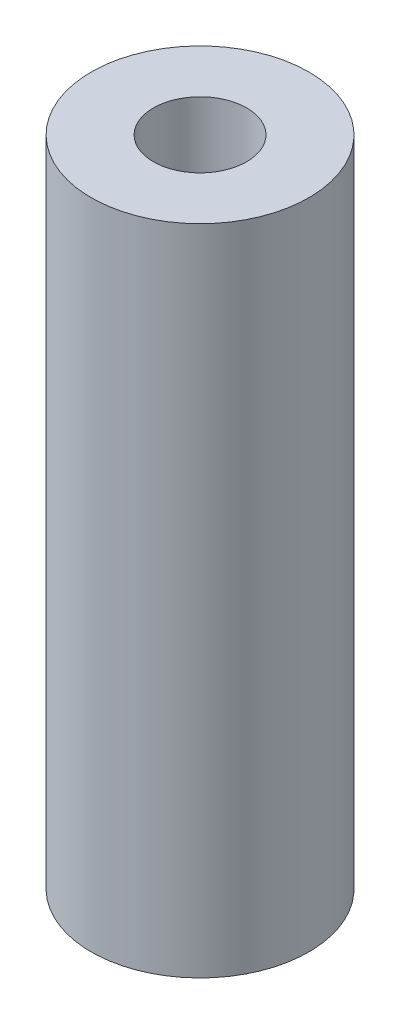
ISO-10303-21;
HEADER;
FILE_DESCRIPTION(('STEP AP214'),'2;1');
FILE_NAME('part.step','',(''),(''),'','','');
FILE_SCHEMA(('AUTOMOTIVE_DESIGN { 1 0 10303 214 1 1 1 1 }'));
ENDSEC;
DATA;
#1=APPLICATION_CONTEXT('core data for automotive mechanical design processes');
#2=APPLICATION_PROTOCOL_DEFINITION('international standard','automotive_design',2000,#1);
#3=PRODUCT_CONTEXT('',#1,'mechanical');
#4=PRODUCT('Part','Part','',(#3));
#5=PRODUCT_RELATED_PRODUCT_CATEGORY('part','',(#4));
#6=PRODUCT_DEFINITION_FORMATION('','',#4);
#7=PRODUCT_DEFINITION_CONTEXT('part definition',#1,'design');
#8=PRODUCT_DEFINITION('design','',#6,#7);
#9=PRODUCT_DEFINITION_SHAPE('','',#8);
#10=(LENGTH_UNIT() NAMED_UNIT(*) SI_UNIT(.MILLI.,.METRE.));
#11=(NAMED_UNIT(*) PLANE_ANGLE_UNIT() SI_UNIT($,.RADIAN.));
#12=(NAMED_UNIT(*) SI_UNIT($,.STERADIAN.) SOLID_ANGLE_UNIT());
#13=UNCERTAINTY_MEASURE_WITH_UNIT(LENGTH_MEASURE(1.E-05),#10,'distance_accuracy_value','');
#14=(GEOMETRIC_REPRESENTATION_CONTEXT(3) GLOBAL_UNCERTAINTY_ASSIGNED_CONTEXT((#13)) GLOBAL_UNIT_ASSIGNED_CONTEXT((#10,
#11,#12)) REPRESENTATION_CONTEXT('',''));
#15=CARTESIAN_POINT('',(0.,0.,0.));
#16=DIRECTION('',(0.,0.,1.));
#17=DIRECTION('',(1.,0.,0.));
#18=AXIS2_PLACEMENT_3D('',#15,#16,#17);
#19=CARTESIAN_POINT('',(0.,21.,0.));
#20=DIRECTION('',(0.,1.,0.));
#21=DIRECTION('',(0.,0.,1.));
#22=AXIS2_PLACEMENT_3D('',#19,#20,#21);
#23=PLANE('',#22);
#24=CARTESIAN_POINT('',(0.,21.,0.));
#25=DIRECTION('',(0.,1.,0.));
#26=DIRECTION('',(0.,0.,1.));
#27=AXIS2_PLACEMENT_3D('',#24,#25,#26);
#28=CIRCLE('',#27,3.5);
#29=CARTESIAN_POINT('',(0.,21.,-3.5));
#30=VERTEX_POINT('',#29);
#31=EDGE_CURVE('E10',#30,#30,#28,.T.);
#32=ORIENTED_EDGE('',*,*,#31,.T.);
#33=EDGE_LOOP('',(#32));
#34=FACE_BOUND('',#33,.T.);
#35=CARTESIAN_POINT('',(0.,21.,0.));
#36=DIRECTION('',(0.,1.,0.));
#37=DIRECTION('',(0.,0.,1.));
#38=AXIS2_PLACEMENT_3D('',#35,#36,#37);
#39=CIRCLE('',#38,1.5);
#40=CARTESIAN_POINT('',(0.,21.,-1.5));
#41=VERTEX_POINT('',#40);
#42=EDGE_CURVE('E42',#41,#41,#39,.T.);
#43=ORIENTED_EDGE('',*,*,#42,.F.);
#44=EDGE_LOOP('',(#43));
#45=FACE_BOUND('',#44,.T.);
#46=ADVANCED_FACE('F31',(#34,#45),#23,.T.);
#47=CARTESIAN_POINT('',(0.,0.,0.));
#48=DIRECTION('',(0.,1.,0.));
#49=DIRECTION('',(0.,0.,1.));
#50=AXIS2_PLACEMENT_3D('',#47,#48,#49);
#51=PLANE('',#50);
#52=CARTESIAN_POINT('',(0.,0.,0.));
#53=DIRECTION('',(0.,1.,0.));
#54=DIRECTION('',(0.,0.,1.));
#55=AXIS2_PLACEMENT_3D('',#52,#53,#54);
#56=CIRCLE('',#55,3.5);
#57=CARTESIAN_POINT('',(0.,0.,-3.5));
#58=VERTEX_POINT('',#57);
#59=EDGE_CURVE('E35',#58,#58,#56,.T.);
#60=ORIENTED_EDGE('',*,*,#59,.F.);
#61=EDGE_LOOP('',(#60));
#62=FACE_BOUND('',#61,.T.);
#63=CARTESIAN_POINT('',(0.,0.,0.));
#64=DIRECTION('',(0.,1.,0.));
#65=DIRECTION('',(0.,0.,1.));
#66=AXIS2_PLACEMENT_3D('',#63,#64,#65);
#67=CIRCLE('',#66,1.5);
#68=CARTESIAN_POINT('',(0.,0.,-1.5));
#69=VERTEX_POINT('',#68);
#70=EDGE_CURVE('E44',#69,#69,#67,.T.);
#71=ORIENTED_EDGE('',*,*,#70,.T.);
#72=EDGE_LOOP('',(#71));
#73=FACE_BOUND('',#72,.T.);
#74=ADVANCED_FACE('F54',(#62,#73),#51,.F.);
#75=CARTESIAN_POINT('',(0.,21.,0.));
#76=DIRECTION('',(0.,-1.,0.));
#77=DIRECTION('',(0.,0.,-1.));
#78=AXIS2_PLACEMENT_3D('',#75,#76,#77);
#79=CYLINDRICAL_SURFACE('',#78,3.5);
#80=CARTESIAN_POINT('',(0.,21.,-3.5));
#81=CARTESIAN_POINT('',(0.,20.78125,-3.5));
#82=CARTESIAN_POINT('',(0.,20.5625,-3.5));
#83=CARTESIAN_POINT('',(0.,20.125,-3.5));
#84=CARTESIAN_POINT('',(0.,19.90625,-3.5));
#85=CARTESIAN_POINT('',(0.,19.46875,-3.5));
#86=CARTESIAN_POINT('',(0.,19.25,-3.5));
#87=CARTESIAN_POINT('',(0.,18.8125,-3.5));
#88=CARTESIAN_POINT('',(0.,18.59375,-3.5));
#89=CARTESIAN_POINT('',(0.,18.15625,-3.5));
#90=CARTESIAN_POINT('',(0.,17.9375,-3.5));
#91=CARTESIAN_POINT('',(0.,17.5,-3.5));
#92=CARTESIAN_POINT('',(0.,17.28125,-3.5));
#93=CARTESIAN_POINT('',(0.,16.84375,-3.5));
#94=CARTESIAN_POINT('',(0.,16.625,-3.5));
#95=CARTESIAN_POINT('',(0.,16.1875,-3.5));
#96=CARTESIAN_POINT('',(0.,15.96875,-3.5));
#97=CARTESIAN_POINT('',(0.,15.53125,-3.5));
#98=CARTESIAN_POINT('',(0.,15.3125,-3.5));
#99=CARTESIAN_POINT('',(0.,14.875,-3.5));
#100=CARTESIAN_POINT('',(0.,14.65625,-3.5));
#101=CARTESIAN_POINT('',(0.,14.21875,-3.5));
#102=CARTESIAN_POINT('',(0.,14.,-3.5));
#103=CARTESIAN_POINT('',(0.,13.5625,-3.5));
#104=CARTESIAN_POINT('',(0.,13.34375,-3.5));
#105=CARTESIAN_POINT('',(0.,12.90625,-3.5));
#106=CARTESIAN_POINT('',(0.,12.6875,-3.5));
#107=CARTESIAN_POINT('',(0.,12.25,-3.5));
#108=CARTESIAN_POINT('',(0.,12.03125,-3.5));
#109=CARTESIAN_POINT('',(0.,11.59375,-3.5));
#110=CARTESIAN_POINT('',(0.,11.375,-3.5));
#111=CARTESIAN_POINT('',(0.,10.9375,-3.5));
#112=CARTESIAN_POINT('',(0.,10.71875,-3.5));
#113=CARTESIAN_POINT('',(0.,10.28125,-3.5));
#114=CARTESIAN_POINT('',(0.,10.0625,-3.5));
#115=CARTESIAN_POINT('',(0.,9.625,-3.5));
#116=CARTESIAN_POINT('',(0.,9.40625,-3.5));
#117=CARTESIAN_POINT('',(0.,8.96875,-3.5));
#118=CARTESIAN_POINT('',(0.,8.75,-3.5));
#119=CARTESIAN_POINT('',(0.,8.3125,-3.5));
#120=CARTESIAN_POINT('',(0.,8.09375,-3.5));
#121=CARTESIAN_POINT('',(0.,7.65625,-3.5));
#122=CARTESIAN_POINT('',(0.,7.4375,-3.5));
#123=CARTESIAN_POINT('',(0.,7.,-3.5));
#124=CARTESIAN_POINT('',(0.,6.78125,-3.5));
#125=CARTESIAN_POINT('',(0.,6.34375,-3.5));
#126=CARTESIAN_POINT('',(0.,6.125,-3.5));
#127=CARTESIAN_POINT('',(0.,5.6875,-3.5));
#128=CARTESIAN_POINT('',(0.,5.46875,-3.5));
#129=CARTESIAN_POINT('',(0.,5.03125,-3.5));
#130=CARTESIAN_POINT('',(0.,4.8125,-3.5));
#131=CARTESIAN_POINT('',(0.,4.375,-3.5));
#132=CARTESIAN_POINT('',(0.,4.15625,-3.5));
#133=CARTESIAN_POINT('',(0.,3.71875,-3.5));
#134=CARTESIAN_POINT('',(0.,3.5,-3.5));
#135=CARTESIAN_POINT('',(0.,3.0625,-3.5));
#136=CARTESIAN_POINT('',(0.,2.84375,-3.5));
#137=CARTESIAN_POINT('',(0.,2.40625,-3.5));
#138=CARTESIAN_POINT('',(0.,2.1875,-3.5));
#139=CARTESIAN_POINT('',(0.,1.75,-3.5));
#140=CARTESIAN_POINT('',(0.,1.53125,-3.5));
#141=CARTESIAN_POINT('',(0.,1.09375,-3.5));
#142=CARTESIAN_POINT('',(0.,0.875000000000001,-3.5));
#143=CARTESIAN_POINT('',(0.,0.4375,-3.5));
#144=CARTESIAN_POINT('',(0.,0.21875,-3.5));
#145=CARTESIAN_POINT('',(0.,0.,-3.5));
#146=B_SPLINE_CURVE_WITH_KNOTS('',3,(#80,#81,#82,#83,#84,#85,#86,#87,#88,#89,#90,#91,#92,#93,
#94,#95,#96,#97,#98,#99,#100,#101,#102,#103,#104,#105,#106,#107,#108,#109,#110,#111,#112,#113,
#114,#115,#116,#117,#118,#119,#120,#121,#122,#123,#124,#125,#126,#127,#128,#129,#130,#131,#132,
#133,#134,#135,#136,#137,#138,#139,#140,#141,#142,#143,#144,#145),.UNSPECIFIED.,.F.,.F.,(4,2,2,
2,2,2,2,2,2,2,2,2,2,2,2,2,2,2,2,2,2,2,2,2,2,2,2,2,2,2,2,2,4),(0.,0.656249999999997,1.3125,
1.96875,2.625,3.28125,3.9375,4.59375,5.25,5.90625,6.5625,7.21875,7.875,8.53125,9.1875,9.84375,
10.5,11.15625,11.8125,12.46875,13.125,13.78125,14.4375,15.09375,15.75,16.40625,17.0625,17.71875,
18.375,19.03125,19.6875,20.34375,21.),.UNSPECIFIED.);
#147=EDGE_CURVE('BSEAM33',#30,#58,#146,.T.);
#148=ORIENTED_EDGE('',*,*,#31,.F.);
#149=ORIENTED_EDGE('',*,*,#59,.T.);
#150=ORIENTED_EDGE('',*,*,#147,.T.);
#151=ORIENTED_EDGE('',*,*,#147,.F.);
#152=EDGE_LOOP('',(#148,#150,#149,#151));
#153=FACE_BOUND('',#152,.T.);
#154=ADVANCED_FACE('F33',(#153),#79,.T.);
#155=CARTESIAN_POINT('',(0.,21.,0.));
#156=DIRECTION('',(0.,-1.,0.));
#157=DIRECTION('',(0.,0.,-1.));
#158=AXIS2_PLACEMENT_3D('',#155,#156,#157);
#159=CYLINDRICAL_SURFACE('',#158,1.5);
#160=CARTESIAN_POINT('',(0.,21.,-1.5));
#161=CARTESIAN_POINT('',(0.,20.78125,-1.5));
#162=CARTESIAN_POINT('',(0.,20.5625,-1.5));
#163=CARTESIAN_POINT('',(0.,20.125,-1.5));
#164=CARTESIAN_POINT('',(0.,19.90625,-1.5));
#165=CARTESIAN_POINT('',(0.,19.46875,-1.5));
#166=CARTESIAN_POINT('',(0.,19.25,-1.5));
#167=CARTESIAN_POINT('',(0.,18.8125,-1.5));
#168=CARTESIAN_POINT('',(0.,18.59375,-1.5));
#169=CARTESIAN_POINT('',(0.,18.15625,-1.5));
#170=CARTESIAN_POINT('',(0.,17.9375,-1.5));
#171=CARTESIAN_POINT('',(0.,17.5,-1.5));
#172=CARTESIAN_POINT('',(0.,17.28125,-1.5));
#173=CARTESIAN_POINT('',(0.,16.84375,-1.5));
#174=CARTESIAN_POINT('',(0.,16.625,-1.5));
#175=CARTESIAN_POINT('',(0.,16.1875,-1.5));
#176=CARTESIAN_POINT('',(0.,15.96875,-1.5));
#177=CARTESIAN_POINT('',(0.,15.53125,-1.5));
#178=CARTESIAN_POINT('',(0.,15.3125,-1.5));
#179=CARTESIAN_POINT('',(0.,14.875,-1.5));
#180=CARTESIAN_POINT('',(0.,14.65625,-1.5));
#181=CARTESIAN_POINT('',(0.,14.21875,-1.5));
#182=CARTESIAN_POINT('',(0.,14.,-1.5));
#183=CARTESIAN_POINT('',(0.,13.5625,-1.5));
#184=CARTESIAN_POINT('',(0.,13.34375,-1.5));
#185=CARTESIAN_POINT('',(0.,12.90625,-1.5));
#186=CARTESIAN_POINT('',(0.,12.6875,-1.5));
#187=CARTESIAN_POINT('',(0.,12.25,-1.5));
#188=CARTESIAN_POINT('',(0.,12.03125,-1.5));
#189=CARTESIAN_POINT('',(0.,11.59375,-1.5));
#190=CARTESIAN_POINT('',(0.,11.375,-1.5));
#191=CARTESIAN_POINT('',(0.,10.9375,-1.5));
#192=CARTESIAN_POINT('',(0.,10.71875,-1.5));
#193=CARTESIAN_POINT('',(0.,10.28125,-1.5));
#194=CARTESIAN_POINT('',(0.,10.0625,-1.5));
#195=CARTESIAN_POINT('',(0.,9.625,-1.5));
#196=CARTESIAN_POINT('',(0.,9.40625,-1.5));
#197=CARTESIAN_POINT('',(0.,8.96875,-1.5));
#198=CARTESIAN_POINT('',(0.,8.75,-1.5));
#199=CARTESIAN_POINT('',(0.,8.3125,-1.5));
#200=CARTESIAN_POINT('',(0.,8.09375,-1.5));
#201=CARTESIAN_POINT('',(0.,7.65625,-1.5));
#202=CARTESIAN_POINT('',(0.,7.4375,-1.5));
#203=CARTESIAN_POINT('',(0.,7.,-1.5));
#204=CARTESIAN_POINT('',(0.,6.78125,-1.5));
#205=CARTESIAN_POINT('',(0.,6.34375,-1.5));
#206=CARTESIAN_POINT('',(0.,6.125,-1.5));
#207=CARTESIAN_POINT('',(0.,5.6875,-1.5));
#208=CARTESIAN_POINT('',(0.,5.46875,-1.5));
#209=CARTESIAN_POINT('',(0.,5.03125,-1.5));
#210=CARTESIAN_POINT('',(0.,4.8125,-1.5));
#211=CARTESIAN_POINT('',(0.,4.375,-1.5));
#212=CARTESIAN_POINT('',(0.,4.15625,-1.5));
#213=CARTESIAN_POINT('',(0.,3.71875,-1.5));
#214=CARTESIAN_POINT('',(0.,3.5,-1.5));
#215=CARTESIAN_POINT('',(0.,3.0625,-1.5));
#216=CARTESIAN_POINT('',(0.,2.84375,-1.5));
#217=CARTESIAN_POINT('',(0.,2.40625,-1.5));
#218=CARTESIAN_POINT('',(0.,2.1875,-1.5));
#219=CARTESIAN_POINT('',(0.,1.75,-1.5));
#220=CARTESIAN_POINT('',(0.,1.53125,-1.5));
#221=CARTESIAN_POINT('',(0.,1.09375,-1.5));
#222=CARTESIAN_POINT('',(0.,0.875000000000001,-1.5));
#223=CARTESIAN_POINT('',(0.,0.4375,-1.5));
#224=CARTESIAN_POINT('',(0.,0.21875,-1.5));
#225=CARTESIAN_POINT('',(0.,0.,-1.5));
#226=B_SPLINE_CURVE_WITH_KNOTS('',3,(#160,#161,#162,#163,#164,#165,#166,#167,#168,#169,#170,
#171,#172,#173,#174,#175,#176,#177,#178,#179,#180,#181,#182,#183,#184,#185,#186,#187,#188,#189,
#190,#191,#192,#193,#194,#195,#196,#197,#198,#199,#200,#201,#202,#203,#204,#205,#206,#207,#208,
#209,#210,#211,#212,#213,#214,#215,#216,#217,#218,#219,#220,#221,#222,#223,#224,#225),
.UNSPECIFIED.,.F.,.F.,(4,2,2,2,2,2,2,2,2,2,2,2,2,2,2,2,2,2,2,2,2,2,2,2,2,2,2,2,2,2,2,2,4),(0.,
0.656249999999997,1.3125,1.96875,2.625,3.28125,3.9375,4.59375,5.25,5.90625,6.5625,7.21875,7.875,
8.53125,9.1875,9.84375,10.5,11.15625,11.8125,12.46875,13.125,13.78125,14.4375,15.09375,15.75,
16.40625,17.0625,17.71875,18.375,19.03125,19.6875,20.34375,21.),.UNSPECIFIED.);
#227=EDGE_CURVE('BSEAM50',#41,#69,#226,.T.);
#228=ORIENTED_EDGE('',*,*,#42,.T.);
#229=ORIENTED_EDGE('',*,*,#70,.F.);
#230=ORIENTED_EDGE('',*,*,#227,.T.);
#231=ORIENTED_EDGE('',*,*,#227,.F.);
#232=EDGE_LOOP('',(#228,#230,#229,#231));
#233=FACE_BOUND('',#232,.T.);
#234=ADVANCED_FACE('F50',(#233),#159,.F.);
#235=CLOSED_SHELL('',(#46,#74,#154,#234));
#236=MANIFOLD_SOLID_BREP('B2',#235);
#237=ADVANCED_BREP_SHAPE_REPRESENTATION('',(#18,#236),#14);
#238=SHAPE_DEFINITION_REPRESENTATION(#9,#237);
ENDSEC;
END-ISO-10303-21;
